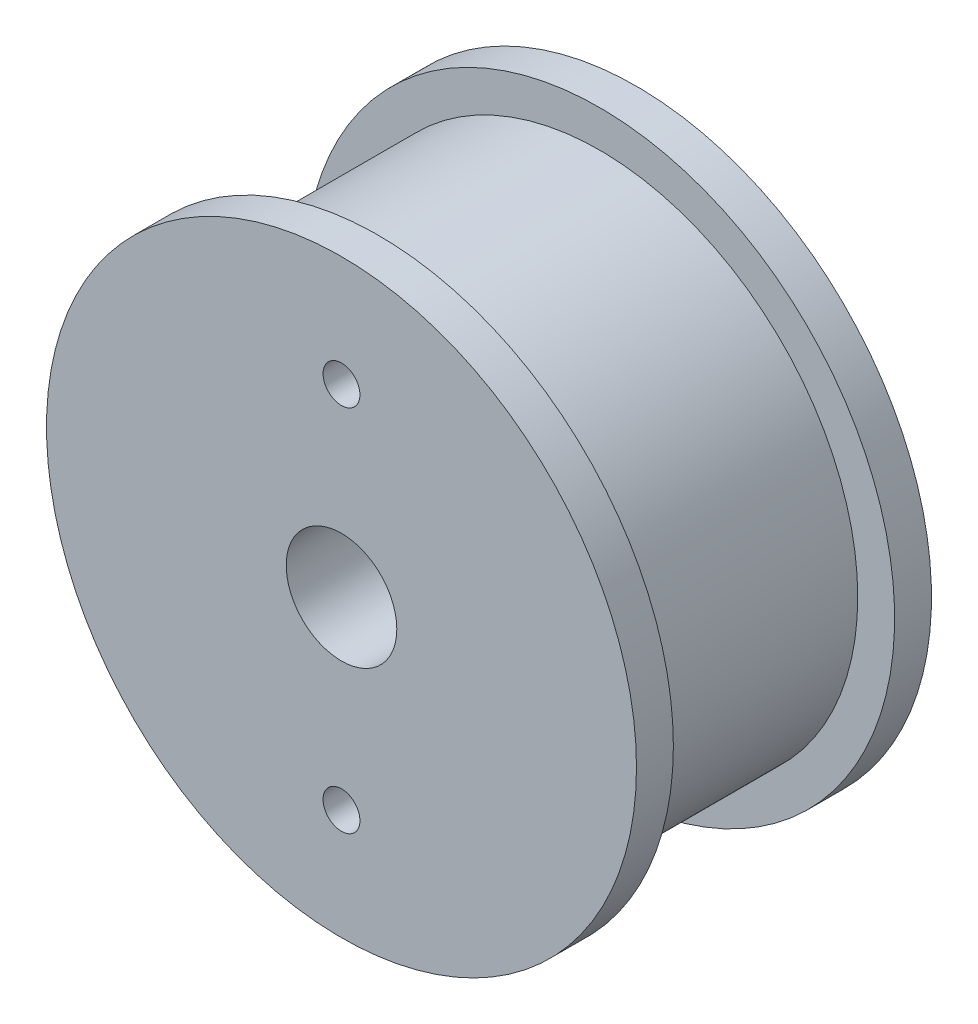
ISO-10303-21;
HEADER;
FILE_DESCRIPTION(('STEP AP214'),'2;1');
FILE_NAME('part.step','',(''),(''),'','','');
FILE_SCHEMA(('AUTOMOTIVE_DESIGN { 1 0 10303 214 1 1 1 1 }'));
ENDSEC;
DATA;
#1=APPLICATION_CONTEXT('core data for automotive mechanical design processes');
#2=APPLICATION_PROTOCOL_DEFINITION('international standard','automotive_design',2000,#1);
#3=PRODUCT_CONTEXT('',#1,'mechanical');
#4=PRODUCT('Part','Part','',(#3));
#5=PRODUCT_RELATED_PRODUCT_CATEGORY('part','',(#4));
#6=PRODUCT_DEFINITION_FORMATION('','',#4);
#7=PRODUCT_DEFINITION_CONTEXT('part definition',#1,'design');
#8=PRODUCT_DEFINITION('design','',#6,#7);
#9=PRODUCT_DEFINITION_SHAPE('','',#8);
#10=(LENGTH_UNIT() NAMED_UNIT(*) SI_UNIT(.MILLI.,.METRE.));
#11=(NAMED_UNIT(*) PLANE_ANGLE_UNIT() SI_UNIT($,.RADIAN.));
#12=(NAMED_UNIT(*) SI_UNIT($,.STERADIAN.) SOLID_ANGLE_UNIT());
#13=UNCERTAINTY_MEASURE_WITH_UNIT(LENGTH_MEASURE(1.E-05),#10,'distance_accuracy_value','');
#14=(GEOMETRIC_REPRESENTATION_CONTEXT(3) GLOBAL_UNCERTAINTY_ASSIGNED_CONTEXT((#13)) GLOBAL_UNIT_ASSIGNED_CONTEXT((#10,
#11,#12)) REPRESENTATION_CONTEXT('',''));
#15=CARTESIAN_POINT('',(0.,0.,0.));
#16=DIRECTION('',(0.,0.,1.));
#17=DIRECTION('',(1.,0.,0.));
#18=AXIS2_PLACEMENT_3D('',#15,#16,#17);
#19=CARTESIAN_POINT('',(0.,0.,25.));
#20=DIRECTION('',(0.,0.,-1.));
#21=DIRECTION('',(-1.,0.,0.));
#22=AXIS2_PLACEMENT_3D('',#19,#20,#21);
#23=CYLINDRICAL_SURFACE('',#22,12.);
#24=CARTESIAN_POINT('',(0.,0.,20.));
#25=DIRECTION('',(0.,0.,1.));
#26=DIRECTION('',(1.,0.,0.));
#27=AXIS2_PLACEMENT_3D('',#24,#25,#26);
#28=CIRCLE('',#27,12.);
#29=CARTESIAN_POINT('',(12.,0.,20.));
#30=VERTEX_POINT('',#29);
#31=EDGE_CURVE('E47',#30,#30,#28,.T.);
#32=ORIENTED_EDGE('',*,*,#31,.T.);
#33=EDGE_LOOP('',(#32));
#34=FACE_BOUND('',#33,.T.);
#35=CARTESIAN_POINT('',(0.,0.,-5.));
#36=DIRECTION('',(0.,0.,-1.));
#37=DIRECTION('',(-1.,0.,0.));
#38=AXIS2_PLACEMENT_3D('',#35,#36,#37);
#39=CIRCLE('',#38,12.);
#40=CARTESIAN_POINT('',(-12.,0.,-5.));
#41=VERTEX_POINT('',#40);
#42=EDGE_CURVE('E69',#41,#41,#39,.T.);
#43=ORIENTED_EDGE('',*,*,#42,.T.);
#44=EDGE_LOOP('',(#43));
#45=FACE_BOUND('',#44,.T.);
#46=ADVANCED_FACE('F39',(#34,#45),#23,.F.);
#47=CARTESIAN_POINT('',(0.,0.,25.));
#48=DIRECTION('',(0.,0.,-1.));
#49=DIRECTION('',(-1.,0.,0.));
#50=AXIS2_PLACEMENT_3D('',#47,#48,#49);
#51=CYLINDRICAL_SURFACE('',#50,35.);
#52=CARTESIAN_POINT('',(0.,0.,0.));
#53=DIRECTION('',(0.,0.,1.));
#54=DIRECTION('',(1.,0.,0.));
#55=AXIS2_PLACEMENT_3D('',#52,#53,#54);
#56=CIRCLE('',#55,35.);
#57=CARTESIAN_POINT('',(35.,0.,0.));
#58=VERTEX_POINT('',#57);
#59=EDGE_CURVE('E43',#58,#58,#56,.T.);
#60=ORIENTED_EDGE('',*,*,#59,.T.);
#61=EDGE_LOOP('',(#60));
#62=FACE_BOUND('',#61,.T.);
#63=CARTESIAN_POINT('',(0.,0.,30.));
#64=DIRECTION('',(0.,0.,1.));
#65=DIRECTION('',(1.,0.,0.));
#66=AXIS2_PLACEMENT_3D('',#63,#64,#65);
#67=CIRCLE('',#66,35.);
#68=CARTESIAN_POINT('',(35.,0.,30.));
#69=VERTEX_POINT('',#68);
#70=EDGE_CURVE('E10',#69,#69,#67,.T.);
#71=ORIENTED_EDGE('',*,*,#70,.F.);
#72=EDGE_LOOP('',(#71));
#73=FACE_BOUND('',#72,.T.);
#74=ADVANCED_FACE('F41',(#62,#73),#51,.T.);
#75=CARTESIAN_POINT('',(0.,0.,20.));
#76=DIRECTION('',(0.,0.,1.));
#77=DIRECTION('',(1.,0.,0.));
#78=AXIS2_PLACEMENT_3D('',#75,#76,#77);
#79=PLANE('',#78);
#80=CARTESIAN_POINT('',(0.,0.,20.));
#81=DIRECTION('',(0.,0.,1.));
#82=DIRECTION('',(1.,0.,0.));
#83=AXIS2_PLACEMENT_3D('',#80,#81,#82);
#84=CIRCLE('',#83,7.5);
#85=CARTESIAN_POINT('',(7.5,0.,20.));
#86=VERTEX_POINT('',#85);
#87=EDGE_CURVE('E51',#86,#86,#84,.T.);
#88=ORIENTED_EDGE('',*,*,#87,.T.);
#89=EDGE_LOOP('',(#88));
#90=FACE_BOUND('',#89,.T.);
#91=ORIENTED_EDGE('',*,*,#31,.F.);
#92=EDGE_LOOP('',(#91));
#93=FACE_BOUND('',#92,.T.);
#94=ADVANCED_FACE('F116',(#90,#93),#79,.F.);
#95=CARTESIAN_POINT('',(0.,0.,20.));
#96=DIRECTION('',(0.,0.,1.));
#97=DIRECTION('',(1.,0.,0.));
#98=AXIS2_PLACEMENT_3D('',#95,#96,#97);
#99=CYLINDRICAL_SURFACE('',#98,7.5);
#100=ORIENTED_EDGE('',*,*,#87,.F.);
#101=EDGE_LOOP('',(#100));
#102=FACE_BOUND('',#101,.T.);
#103=CARTESIAN_POINT('',(0.,0.,35.));
#104=DIRECTION('',(0.,0.,1.));
#105=DIRECTION('',(1.,0.,0.));
#106=AXIS2_PLACEMENT_3D('',#103,#104,#105);
#107=CIRCLE('',#106,7.5);
#108=CARTESIAN_POINT('',(7.5,0.,35.));
#109=VERTEX_POINT('',#108);
#110=EDGE_CURVE('E60',#109,#109,#107,.T.);
#111=ORIENTED_EDGE('',*,*,#110,.T.);
#112=EDGE_LOOP('',(#111));
#113=FACE_BOUND('',#112,.T.);
#114=ADVANCED_FACE('F121',(#102,#113),#99,.F.);
#115=CARTESIAN_POINT('',(0.,0.,35.));
#116=DIRECTION('',(0.,0.,1.));
#117=DIRECTION('',(1.,0.,0.));
#118=AXIS2_PLACEMENT_3D('',#115,#116,#117);
#119=PLANE('',#118);
#120=CARTESIAN_POINT('',(0.,25.,35.));
#121=DIRECTION('',(0.,0.,-1.));
#122=DIRECTION('',(-1.,0.,0.));
#123=AXIS2_PLACEMENT_3D('',#120,#121,#122);
#124=CIRCLE('',#123,2.5);
#125=CARTESIAN_POINT('',(-2.5,25.,35.));
#126=VERTEX_POINT('',#125);
#127=EDGE_CURVE('E74',#126,#126,#124,.T.);
#128=ORIENTED_EDGE('',*,*,#127,.T.);
#129=EDGE_LOOP('',(#128));
#130=FACE_BOUND('',#129,.T.);
#131=CARTESIAN_POINT('',(0.,-25.,35.));
#132=DIRECTION('',(0.,0.,-1.));
#133=DIRECTION('',(-1.,0.,0.));
#134=AXIS2_PLACEMENT_3D('',#131,#132,#133);
#135=CIRCLE('',#134,2.5);
#136=CARTESIAN_POINT('',(-2.5,-25.,35.));
#137=VERTEX_POINT('',#136);
#138=EDGE_CURVE('E75',#137,#137,#135,.T.);
#139=ORIENTED_EDGE('',*,*,#138,.T.);
#140=EDGE_LOOP('',(#139));
#141=FACE_BOUND('',#140,.T.);
#142=CARTESIAN_POINT('',(0.,0.,35.));
#143=DIRECTION('',(0.,0.,1.));
#144=DIRECTION('',(1.,0.,0.));
#145=AXIS2_PLACEMENT_3D('',#142,#143,#144);
#146=CIRCLE('',#145,40.);
#147=CARTESIAN_POINT('',(40.,0.,35.));
#148=VERTEX_POINT('',#147);
#149=EDGE_CURVE('E56',#148,#148,#146,.T.);
#150=ORIENTED_EDGE('',*,*,#149,.T.);
#151=EDGE_LOOP('',(#150));
#152=FACE_BOUND('',#151,.T.);
#153=ORIENTED_EDGE('',*,*,#110,.F.);
#154=EDGE_LOOP('',(#153));
#155=FACE_BOUND('',#154,.T.);
#156=ADVANCED_FACE('F87',(#130,#141,#152,#155),#119,.T.);
#157=CARTESIAN_POINT('',(0.,0.,30.));
#158=DIRECTION('',(0.,0.,1.));
#159=DIRECTION('',(1.,0.,0.));
#160=AXIS2_PLACEMENT_3D('',#157,#158,#159);
#161=PLANE('',#160);
#162=ORIENTED_EDGE('',*,*,#70,.T.);
#163=EDGE_LOOP('',(#162));
#164=FACE_BOUND('',#163,.T.);
#165=CARTESIAN_POINT('',(0.,0.,30.));
#166=DIRECTION('',(0.,0.,1.));
#167=DIRECTION('',(1.,0.,0.));
#168=AXIS2_PLACEMENT_3D('',#165,#166,#167);
#169=CIRCLE('',#168,40.);
#170=CARTESIAN_POINT('',(40.,0.,30.));
#171=VERTEX_POINT('',#170);
#172=EDGE_CURVE('E57',#171,#171,#169,.T.);
#173=ORIENTED_EDGE('',*,*,#172,.F.);
#174=EDGE_LOOP('',(#173));
#175=FACE_BOUND('',#174,.T.);
#176=ADVANCED_FACE('F127',(#164,#175),#161,.F.);
#177=CARTESIAN_POINT('',(0.,0.,35.));
#178=DIRECTION('',(0.,0.,-1.));
#179=DIRECTION('',(-1.,0.,0.));
#180=AXIS2_PLACEMENT_3D('',#177,#178,#179);
#181=CYLINDRICAL_SURFACE('',#180,40.);
#182=ORIENTED_EDGE('',*,*,#149,.F.);
#183=EDGE_LOOP('',(#182));
#184=FACE_BOUND('',#183,.T.);
#185=ORIENTED_EDGE('',*,*,#172,.T.);
#186=EDGE_LOOP('',(#185));
#187=FACE_BOUND('',#186,.T.);
#188=ADVANCED_FACE('F101',(#184,#187),#181,.T.);
#189=CARTESIAN_POINT('',(0.,0.,-5.));
#190=DIRECTION('',(0.,0.,-1.));
#191=DIRECTION('',(-1.,0.,0.));
#192=AXIS2_PLACEMENT_3D('',#189,#190,#191);
#193=PLANE('',#192);
#194=CARTESIAN_POINT('',(0.,25.,-5.));
#195=DIRECTION('',(0.,0.,-1.));
#196=DIRECTION('',(-1.,0.,0.));
#197=AXIS2_PLACEMENT_3D('',#194,#195,#196);
#198=CIRCLE('',#197,2.5);
#199=CARTESIAN_POINT('',(-2.5,25.,-5.));
#200=VERTEX_POINT('',#199);
#201=EDGE_CURVE('E81',#200,#200,#198,.T.);
#202=ORIENTED_EDGE('',*,*,#201,.F.);
#203=EDGE_LOOP('',(#202));
#204=FACE_BOUND('',#203,.T.);
#205=CARTESIAN_POINT('',(0.,-25.,-5.));
#206=DIRECTION('',(0.,0.,-1.));
#207=DIRECTION('',(-1.,0.,0.));
#208=AXIS2_PLACEMENT_3D('',#205,#206,#207);
#209=CIRCLE('',#208,2.5);
#210=CARTESIAN_POINT('',(-2.5,-25.,-5.));
#211=VERTEX_POINT('',#210);
#212=EDGE_CURVE('E78',#211,#211,#209,.T.);
#213=ORIENTED_EDGE('',*,*,#212,.F.);
#214=EDGE_LOOP('',(#213));
#215=FACE_BOUND('',#214,.T.);
#216=CARTESIAN_POINT('',(0.,0.,-5.));
#217=DIRECTION('',(0.,0.,-1.));
#218=DIRECTION('',(-1.,0.,0.));
#219=AXIS2_PLACEMENT_3D('',#216,#217,#218);
#220=CIRCLE('',#219,40.);
#221=CARTESIAN_POINT('',(-40.,0.,-5.));
#222=VERTEX_POINT('',#221);
#223=EDGE_CURVE('E68',#222,#222,#220,.T.);
#224=ORIENTED_EDGE('',*,*,#223,.T.);
#225=EDGE_LOOP('',(#224));
#226=FACE_BOUND('',#225,.T.);
#227=ORIENTED_EDGE('',*,*,#42,.F.);
#228=EDGE_LOOP('',(#227));
#229=FACE_BOUND('',#228,.T.);
#230=ADVANCED_FACE('F97',(#204,#215,#226,#229),#193,.T.);
#231=CARTESIAN_POINT('',(0.,0.,0.));
#232=DIRECTION('',(0.,0.,-1.));
#233=DIRECTION('',(-1.,0.,0.));
#234=AXIS2_PLACEMENT_3D('',#231,#232,#233);
#235=PLANE('',#234);
#236=ORIENTED_EDGE('',*,*,#59,.F.);
#237=EDGE_LOOP('',(#236));
#238=FACE_BOUND('',#237,.T.);
#239=CARTESIAN_POINT('',(0.,0.,0.));
#240=DIRECTION('',(0.,0.,-1.));
#241=DIRECTION('',(-1.,0.,0.));
#242=AXIS2_PLACEMENT_3D('',#239,#240,#241);
#243=CIRCLE('',#242,40.);
#244=CARTESIAN_POINT('',(-40.,0.,0.));
#245=VERTEX_POINT('',#244);
#246=EDGE_CURVE('E65',#245,#245,#243,.T.);
#247=ORIENTED_EDGE('',*,*,#246,.F.);
#248=EDGE_LOOP('',(#247));
#249=FACE_BOUND('',#248,.T.);
#250=ADVANCED_FACE('F100',(#238,#249),#235,.F.);
#251=CARTESIAN_POINT('',(0.,0.,-5.));
#252=DIRECTION('',(0.,0.,1.));
#253=DIRECTION('',(1.,0.,0.));
#254=AXIS2_PLACEMENT_3D('',#251,#252,#253);
#255=CYLINDRICAL_SURFACE('',#254,40.);
#256=ORIENTED_EDGE('',*,*,#223,.F.);
#257=EDGE_LOOP('',(#256));
#258=FACE_BOUND('',#257,.T.);
#259=ORIENTED_EDGE('',*,*,#246,.T.);
#260=EDGE_LOOP('',(#259));
#261=FACE_BOUND('',#260,.T.);
#262=ADVANCED_FACE('F133',(#258,#261),#255,.T.);
#263=CARTESIAN_POINT('',(0.,-25.,35.));
#264=DIRECTION('',(0.,0.,-1.));
#265=DIRECTION('',(-1.,0.,0.));
#266=AXIS2_PLACEMENT_3D('',#263,#264,#265);
#267=CYLINDRICAL_SURFACE('',#266,2.5);
#268=ORIENTED_EDGE('',*,*,#138,.F.);
#269=EDGE_LOOP('',(#268));
#270=FACE_BOUND('',#269,.T.);
#271=ORIENTED_EDGE('',*,*,#212,.T.);
#272=EDGE_LOOP('',(#271));
#273=FACE_BOUND('',#272,.T.);
#274=ADVANCED_FACE('F93',(#270,#273),#267,.F.);
#275=CARTESIAN_POINT('',(0.,25.,35.));
#276=DIRECTION('',(0.,0.,-1.));
#277=DIRECTION('',(-1.,0.,0.));
#278=AXIS2_PLACEMENT_3D('',#275,#276,#277);
#279=CYLINDRICAL_SURFACE('',#278,2.5);
#280=ORIENTED_EDGE('',*,*,#127,.F.);
#281=EDGE_LOOP('',(#280));
#282=FACE_BOUND('',#281,.T.);
#283=ORIENTED_EDGE('',*,*,#201,.T.);
#284=EDGE_LOOP('',(#283));
#285=FACE_BOUND('',#284,.T.);
#286=ADVANCED_FACE('F90',(#282,#285),#279,.F.);
#287=CLOSED_SHELL('',(#46,#74,#94,#114,#156,#176,#188,#230,#250,#262,#274,#286));
#288=MANIFOLD_SOLID_BREP('B2',#287);
#289=ADVANCED_BREP_SHAPE_REPRESENTATION('',(#18,#288),#14);
#290=SHAPE_DEFINITION_REPRESENTATION(#9,#289);
ENDSEC;
END-ISO-10303-21;
